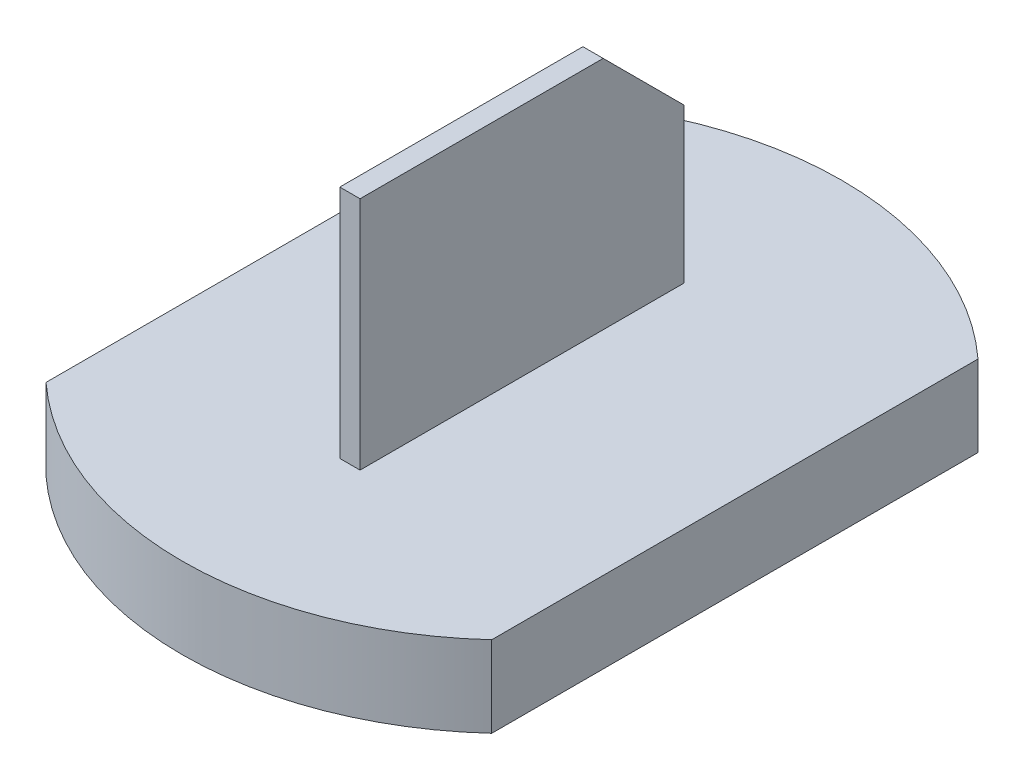
ISO-10303-21;
HEADER;
FILE_DESCRIPTION(('STEP AP214'),'2;1');
FILE_NAME('part.step','',(''),(''),'','','');
FILE_SCHEMA(('AUTOMOTIVE_DESIGN { 1 0 10303 214 1 1 1 1 }'));
ENDSEC;
DATA;
#1=APPLICATION_CONTEXT('core data for automotive mechanical design processes');
#2=APPLICATION_PROTOCOL_DEFINITION('international standard','automotive_design',2000,#1);
#3=PRODUCT_CONTEXT('',#1,'mechanical');
#4=PRODUCT('Part','Part','',(#3));
#5=PRODUCT_RELATED_PRODUCT_CATEGORY('part','',(#4));
#6=PRODUCT_DEFINITION_FORMATION('','',#4);
#7=PRODUCT_DEFINITION_CONTEXT('part definition',#1,'design');
#8=PRODUCT_DEFINITION('design','',#6,#7);
#9=PRODUCT_DEFINITION_SHAPE('','',#8);
#10=(LENGTH_UNIT() NAMED_UNIT(*) SI_UNIT(.MILLI.,.METRE.));
#11=(NAMED_UNIT(*) PLANE_ANGLE_UNIT() SI_UNIT($,.RADIAN.));
#12=(NAMED_UNIT(*) SI_UNIT($,.STERADIAN.) SOLID_ANGLE_UNIT());
#13=UNCERTAINTY_MEASURE_WITH_UNIT(LENGTH_MEASURE(1.E-05),#10,'distance_accuracy_value','');
#14=(GEOMETRIC_REPRESENTATION_CONTEXT(3) GLOBAL_UNCERTAINTY_ASSIGNED_CONTEXT((#13)) GLOBAL_UNIT_ASSIGNED_CONTEXT((#10,
#11,#12)) REPRESENTATION_CONTEXT('',''));
#15=CARTESIAN_POINT('',(0.,0.,0.));
#16=DIRECTION('',(0.,0.,1.));
#17=DIRECTION('',(1.,0.,0.));
#18=AXIS2_PLACEMENT_3D('',#15,#16,#17);
#19=CARTESIAN_POINT('',(34.925,6.35,0.));
#20=DIRECTION('',(1.,0.,0.));
#21=DIRECTION('',(0.,0.,-1.));
#22=AXIS2_PLACEMENT_3D('',#19,#20,#21);
#23=PLANE('',#22);
#24=DIRECTION('',(0.,0.,1.));
#25=VECTOR('',#24,1.);
#26=CARTESIAN_POINT('',(34.925,-6.35,0.));
#27=LINE('',#26,#25);
#28=CARTESIAN_POINT('',(34.925,-6.35,-38.1));
#29=VERTEX_POINT('',#28);
#30=CARTESIAN_POINT('',(34.925,-6.35,38.1));
#31=VERTEX_POINT('',#30);
#32=EDGE_CURVE('E137',#29,#31,#27,.T.);
#33=ORIENTED_EDGE('',*,*,#32,.F.);
#34=DIRECTION('',(0.,-1.,0.));
#35=VECTOR('',#34,1.);
#36=CARTESIAN_POINT('',(34.925,6.35,-38.1));
#37=LINE('',#36,#35);
#38=CARTESIAN_POINT('',(34.925,6.35,-38.1));
#39=VERTEX_POINT('',#38);
#40=EDGE_CURVE('E173',#39,#29,#37,.T.);
#41=ORIENTED_EDGE('',*,*,#40,.F.);
#42=DIRECTION('',(0.,0.,1.));
#43=VECTOR('',#42,1.);
#44=CARTESIAN_POINT('',(34.925,6.35,0.));
#45=LINE('',#44,#43);
#46=CARTESIAN_POINT('',(34.925,6.35,38.1));
#47=VERTEX_POINT('',#46);
#48=EDGE_CURVE('E138',#39,#47,#45,.T.);
#49=ORIENTED_EDGE('',*,*,#48,.T.);
#50=DIRECTION('',(0.,-1.,0.));
#51=VECTOR('',#50,1.);
#52=CARTESIAN_POINT('',(34.925,6.35,38.1));
#53=LINE('',#52,#51);
#54=EDGE_CURVE('E157',#47,#31,#53,.T.);
#55=ORIENTED_EDGE('',*,*,#54,.T.);
#56=EDGE_LOOP('',(#33,#41,#49,#55));
#57=FACE_BOUND('',#56,.T.);
#58=ADVANCED_FACE('F41',(#57),#23,.T.);
#59=CARTESIAN_POINT('',(0.,6.35,0.));
#60=DIRECTION('',(0.,-1.,0.));
#61=DIRECTION('',(0.,0.,-1.));
#62=AXIS2_PLACEMENT_3D('',#59,#60,#61);
#63=CYLINDRICAL_SURFACE('',#62,51.6852553926166);
#64=CARTESIAN_POINT('',(0.,-6.35,0.));
#65=DIRECTION('',(0.,1.,0.));
#66=DIRECTION('',(0.,0.,1.));
#67=AXIS2_PLACEMENT_3D('',#64,#65,#66);
#68=CIRCLE('',#67,51.6852553926166);
#69=CARTESIAN_POINT('',(-34.925,-6.35,-38.1));
#70=VERTEX_POINT('',#69);
#71=EDGE_CURVE('E160',#29,#70,#68,.T.);
#72=ORIENTED_EDGE('',*,*,#71,.T.);
#73=DIRECTION('',(0.,-1.,0.));
#74=VECTOR('',#73,1.);
#75=CARTESIAN_POINT('',(-34.925,6.35,-38.1));
#76=LINE('',#75,#74);
#77=CARTESIAN_POINT('',(-34.925,6.35,-38.1));
#78=VERTEX_POINT('',#77);
#79=EDGE_CURVE('E171',#78,#70,#76,.T.);
#80=ORIENTED_EDGE('',*,*,#79,.F.);
#81=CARTESIAN_POINT('',(0.,6.35,0.));
#82=DIRECTION('',(0.,1.,0.));
#83=DIRECTION('',(0.,0.,1.));
#84=AXIS2_PLACEMENT_3D('',#81,#82,#83);
#85=CIRCLE('',#84,51.6852553926166);
#86=EDGE_CURVE('E141',#39,#78,#85,.T.);
#87=ORIENTED_EDGE('',*,*,#86,.F.);
#88=ORIENTED_EDGE('',*,*,#40,.T.);
#89=EDGE_LOOP('',(#72,#80,#87,#88));
#90=FACE_BOUND('',#89,.T.);
#91=ADVANCED_FACE('F196',(#90),#63,.T.);
#92=CARTESIAN_POINT('',(-34.925,6.35,0.));
#93=DIRECTION('',(-1.,0.,0.));
#94=DIRECTION('',(0.,0.,1.));
#95=AXIS2_PLACEMENT_3D('',#92,#93,#94);
#96=PLANE('',#95);
#97=DIRECTION('',(0.,0.,-1.));
#98=VECTOR('',#97,1.);
#99=CARTESIAN_POINT('',(-34.925,-6.35,0.));
#100=LINE('',#99,#98);
#101=CARTESIAN_POINT('',(-34.925,-6.35,38.1));
#102=VERTEX_POINT('',#101);
#103=EDGE_CURVE('E163',#102,#70,#100,.T.);
#104=ORIENTED_EDGE('',*,*,#103,.F.);
#105=DIRECTION('',(0.,-1.,0.));
#106=VECTOR('',#105,1.);
#107=CARTESIAN_POINT('',(-34.925,6.35,38.1));
#108=LINE('',#107,#106);
#109=CARTESIAN_POINT('',(-34.925,6.35,38.1));
#110=VERTEX_POINT('',#109);
#111=EDGE_CURVE('E169',#110,#102,#108,.T.);
#112=ORIENTED_EDGE('',*,*,#111,.F.);
#113=DIRECTION('',(0.,0.,-1.));
#114=VECTOR('',#113,1.);
#115=CARTESIAN_POINT('',(-34.925,6.35,0.));
#116=LINE('',#115,#114);
#117=EDGE_CURVE('E144',#110,#78,#116,.T.);
#118=ORIENTED_EDGE('',*,*,#117,.T.);
#119=ORIENTED_EDGE('',*,*,#79,.T.);
#120=EDGE_LOOP('',(#104,#112,#118,#119));
#121=FACE_BOUND('',#120,.T.);
#122=ADVANCED_FACE('F201',(#121),#96,.T.);
#123=CARTESIAN_POINT('',(0.,6.35,0.));
#124=DIRECTION('',(0.,-1.,0.));
#125=DIRECTION('',(0.,0.,-1.));
#126=AXIS2_PLACEMENT_3D('',#123,#124,#125);
#127=CYLINDRICAL_SURFACE('',#126,51.6852553926166);
#128=CARTESIAN_POINT('',(0.,-6.35,0.));
#129=DIRECTION('',(0.,1.,0.));
#130=DIRECTION('',(0.,0.,1.));
#131=AXIS2_PLACEMENT_3D('',#128,#129,#130);
#132=CIRCLE('',#131,51.6852553926166);
#133=EDGE_CURVE('E142',#102,#31,#132,.T.);
#134=ORIENTED_EDGE('',*,*,#133,.T.);
#135=ORIENTED_EDGE('',*,*,#54,.F.);
#136=CARTESIAN_POINT('',(0.,6.35,0.));
#137=DIRECTION('',(0.,1.,0.));
#138=DIRECTION('',(0.,0.,1.));
#139=AXIS2_PLACEMENT_3D('',#136,#137,#138);
#140=CIRCLE('',#139,51.6852553926166);
#141=EDGE_CURVE('E147',#110,#47,#140,.T.);
#142=ORIENTED_EDGE('',*,*,#141,.F.);
#143=ORIENTED_EDGE('',*,*,#111,.T.);
#144=EDGE_LOOP('',(#134,#135,#142,#143));
#145=FACE_BOUND('',#144,.T.);
#146=ADVANCED_FACE('F208',(#145),#127,.T.);
#147=CARTESIAN_POINT('',(0.,6.35,0.));
#148=DIRECTION('',(0.,1.,0.));
#149=DIRECTION('',(0.,0.,1.));
#150=AXIS2_PLACEMENT_3D('',#147,#148,#149);
#151=PLANE('',#150);
#152=ORIENTED_EDGE('',*,*,#48,.F.);
#153=ORIENTED_EDGE('',*,*,#86,.T.);
#154=ORIENTED_EDGE('',*,*,#117,.F.);
#155=ORIENTED_EDGE('',*,*,#141,.T.);
#156=EDGE_LOOP('',(#152,#153,#154,#155));
#157=FACE_BOUND('',#156,.T.);
#158=DIRECTION('',(1.,0.,0.));
#159=VECTOR('',#158,1.);
#160=CARTESIAN_POINT('',(0.,6.35,-25.4));
#161=LINE('',#160,#159);
#162=CARTESIAN_POINT('',(-1.5875,6.35,-25.4));
#163=VERTEX_POINT('',#162);
#164=CARTESIAN_POINT('',(1.5875,6.35,-25.4));
#165=VERTEX_POINT('',#164);
#166=EDGE_CURVE('E149',#163,#165,#161,.T.);
#167=ORIENTED_EDGE('',*,*,#166,.T.);
#168=DIRECTION('',(0.,0.,1.));
#169=VECTOR('',#168,1.);
#170=CARTESIAN_POINT('',(1.5875,6.35,0.));
#171=LINE('',#170,#169);
#172=CARTESIAN_POINT('',(1.5875,6.35,25.4));
#173=VERTEX_POINT('',#172);
#174=EDGE_CURVE('E151',#165,#173,#171,.T.);
#175=ORIENTED_EDGE('',*,*,#174,.T.);
#176=DIRECTION('',(1.,0.,0.));
#177=VECTOR('',#176,1.);
#178=CARTESIAN_POINT('',(0.,6.35,25.4));
#179=LINE('',#178,#177);
#180=CARTESIAN_POINT('',(-1.5875,6.34999999999997,25.4));
#181=VERTEX_POINT('',#180);
#182=EDGE_CURVE('E122',#181,#173,#179,.T.);
#183=ORIENTED_EDGE('',*,*,#182,.F.);
#184=DIRECTION('',(0.,0.,1.));
#185=VECTOR('',#184,1.);
#186=CARTESIAN_POINT('',(-1.5875,6.35,0.));
#187=LINE('',#186,#185);
#188=EDGE_CURVE('E154',#163,#181,#187,.T.);
#189=ORIENTED_EDGE('',*,*,#188,.F.);
#190=EDGE_LOOP('',(#167,#175,#183,#189));
#191=FACE_BOUND('',#190,.T.);
#192=ADVANCED_FACE('F187',(#157,#191),#151,.T.);
#193=CARTESIAN_POINT('',(0.,-6.35,0.));
#194=DIRECTION('',(0.,1.,0.));
#195=DIRECTION('',(0.,0.,1.));
#196=AXIS2_PLACEMENT_3D('',#193,#194,#195);
#197=PLANE('',#196);
#198=ORIENTED_EDGE('',*,*,#32,.T.);
#199=ORIENTED_EDGE('',*,*,#133,.F.);
#200=ORIENTED_EDGE('',*,*,#103,.T.);
#201=ORIENTED_EDGE('',*,*,#71,.F.);
#202=EDGE_LOOP('',(#198,#199,#200,#201));
#203=FACE_BOUND('',#202,.T.);
#204=ADVANCED_FACE('F213',(#203),#197,.F.);
#205=CARTESIAN_POINT('',(-1.5875,-57.2491220454734,-25.4));
#206=DIRECTION('',(0.,0.,1.));
#207=DIRECTION('',(1.,0.,0.));
#208=AXIS2_PLACEMENT_3D('',#205,#206,#207);
#209=PLANE('',#208);
#210=DIRECTION('',(0.,1.,0.));
#211=VECTOR('',#210,1.);
#212=CARTESIAN_POINT('',(-1.5875,-57.2491220454734,-25.4));
#213=LINE('',#212,#211);
#214=CARTESIAN_POINT('',(-1.5875,30.48,-25.4));
#215=VERTEX_POINT('',#214);
#216=EDGE_CURVE('E130',#163,#215,#213,.T.);
#217=ORIENTED_EDGE('',*,*,#216,.T.);
#218=DIRECTION('',(1.,0.,0.));
#219=VECTOR('',#218,1.);
#220=CARTESIAN_POINT('',(-1.5875,30.48,-25.4));
#221=LINE('',#220,#219);
#222=CARTESIAN_POINT('',(1.5875,30.48,-25.4));
#223=VERTEX_POINT('',#222);
#224=EDGE_CURVE('E175',#215,#223,#221,.T.);
#225=ORIENTED_EDGE('',*,*,#224,.T.);
#226=DIRECTION('',(0.,1.,0.));
#227=VECTOR('',#226,1.);
#228=CARTESIAN_POINT('',(1.5875,-57.2491220454734,-25.4));
#229=LINE('',#228,#227);
#230=EDGE_CURVE('E123',#165,#223,#229,.T.);
#231=ORIENTED_EDGE('',*,*,#230,.F.);
#232=ORIENTED_EDGE('',*,*,#166,.F.);
#233=EDGE_LOOP('',(#217,#225,#231,#232));
#234=FACE_BOUND('',#233,.T.);
#235=ADVANCED_FACE('F181',(#234),#209,.F.);
#236=CARTESIAN_POINT('',(1.5875,-57.2491220454734,-25.4));
#237=DIRECTION('',(-1.,0.,0.));
#238=DIRECTION('',(0.,0.,1.));
#239=AXIS2_PLACEMENT_3D('',#236,#237,#238);
#240=PLANE('',#239);
#241=ORIENTED_EDGE('',*,*,#230,.T.);
#242=DIRECTION('',(0.,-0.707106781186547,-0.707106781186548));
#243=VECTOR('',#242,1.);
#244=CARTESIAN_POINT('',(1.5875,30.48,-25.4));
#245=LINE('',#244,#243);
#246=CARTESIAN_POINT('',(1.5875,43.18,-12.7));
#247=VERTEX_POINT('',#246);
#248=EDGE_CURVE('E64',#223,#247,#245,.F.);
#249=ORIENTED_EDGE('',*,*,#248,.T.);
#250=DIRECTION('',(0.,0.,1.));
#251=VECTOR('',#250,1.);
#252=CARTESIAN_POINT('',(1.5875,43.18,-25.4));
#253=LINE('',#252,#251);
#254=CARTESIAN_POINT('',(1.5875,43.18,25.4));
#255=VERTEX_POINT('',#254);
#256=EDGE_CURVE('E109',#247,#255,#253,.T.);
#257=ORIENTED_EDGE('',*,*,#256,.T.);
#258=DIRECTION('',(0.,1.,0.));
#259=VECTOR('',#258,1.);
#260=CARTESIAN_POINT('',(1.5875,-57.2491220454734,25.4));
#261=LINE('',#260,#259);
#262=EDGE_CURVE('E113',#173,#255,#261,.T.);
#263=ORIENTED_EDGE('',*,*,#262,.F.);
#264=ORIENTED_EDGE('',*,*,#174,.F.);
#265=EDGE_LOOP('',(#241,#249,#257,#263,#264));
#266=FACE_BOUND('',#265,.T.);
#267=ADVANCED_FACE('F111',(#266),#240,.F.);
#268=CARTESIAN_POINT('',(-1.5875,-57.2491220454734,25.4));
#269=DIRECTION('',(0.,0.,1.));
#270=DIRECTION('',(1.,0.,0.));
#271=AXIS2_PLACEMENT_3D('',#268,#269,#270);
#272=PLANE('',#271);
#273=DIRECTION('',(0.,1.,0.));
#274=VECTOR('',#273,1.);
#275=CARTESIAN_POINT('',(-1.5875,-57.2491220454734,25.4));
#276=LINE('',#275,#274);
#277=CARTESIAN_POINT('',(-1.5875,43.18,25.4));
#278=VERTEX_POINT('',#277);
#279=EDGE_CURVE('E124',#181,#278,#276,.T.);
#280=ORIENTED_EDGE('',*,*,#279,.F.);
#281=ORIENTED_EDGE('',*,*,#182,.T.);
#282=ORIENTED_EDGE('',*,*,#262,.T.);
#283=DIRECTION('',(1.,0.,0.));
#284=VECTOR('',#283,1.);
#285=CARTESIAN_POINT('',(-1.5875,43.18,25.4));
#286=LINE('',#285,#284);
#287=EDGE_CURVE('E115',#278,#255,#286,.T.);
#288=ORIENTED_EDGE('',*,*,#287,.F.);
#289=EDGE_LOOP('',(#280,#281,#282,#288));
#290=FACE_BOUND('',#289,.T.);
#291=ADVANCED_FACE('F121',(#290),#272,.T.);
#292=CARTESIAN_POINT('',(-1.5875,-57.2491220454734,-25.4));
#293=DIRECTION('',(-1.,0.,0.));
#294=DIRECTION('',(0.,0.,1.));
#295=AXIS2_PLACEMENT_3D('',#292,#293,#294);
#296=PLANE('',#295);
#297=DIRECTION('',(0.,0.,1.));
#298=VECTOR('',#297,1.);
#299=CARTESIAN_POINT('',(-1.5875,43.18,-25.4));
#300=LINE('',#299,#298);
#301=CARTESIAN_POINT('',(-1.5875,43.18,-12.7));
#302=VERTEX_POINT('',#301);
#303=EDGE_CURVE('E127',#302,#278,#300,.T.);
#304=ORIENTED_EDGE('',*,*,#303,.F.);
#305=DIRECTION('',(0.,0.707106781186547,0.707106781186548));
#306=VECTOR('',#305,1.);
#307=CARTESIAN_POINT('',(-1.58750000000001,-13.3845610227366,-69.2645610227367));
#308=LINE('',#307,#306);
#309=EDGE_CURVE('E11',#302,#215,#308,.F.);
#310=ORIENTED_EDGE('',*,*,#309,.T.);
#311=ORIENTED_EDGE('',*,*,#216,.F.);
#312=ORIENTED_EDGE('',*,*,#188,.T.);
#313=ORIENTED_EDGE('',*,*,#279,.T.);
#314=EDGE_LOOP('',(#304,#310,#311,#312,#313));
#315=FACE_BOUND('',#314,.T.);
#316=ADVANCED_FACE('F189',(#315),#296,.T.);
#317=CARTESIAN_POINT('',(0.,43.18,0.));
#318=DIRECTION('',(0.,-1.,0.));
#319=DIRECTION('',(0.,0.,-1.));
#320=AXIS2_PLACEMENT_3D('',#317,#318,#319);
#321=PLANE('',#320);
#322=ORIENTED_EDGE('',*,*,#256,.F.);
#323=DIRECTION('',(-1.,0.,0.));
#324=VECTOR('',#323,1.);
#325=CARTESIAN_POINT('',(0.,43.18,-12.7));
#326=LINE('',#325,#324);
#327=EDGE_CURVE('E50',#247,#302,#326,.T.);
#328=ORIENTED_EDGE('',*,*,#327,.T.);
#329=ORIENTED_EDGE('',*,*,#303,.T.);
#330=ORIENTED_EDGE('',*,*,#287,.T.);
#331=EDGE_LOOP('',(#322,#328,#329,#330));
#332=FACE_BOUND('',#331,.T.);
#333=ADVANCED_FACE('F126',(#332),#321,.F.);
#334=CARTESIAN_POINT('',(-1.5875,30.48,-25.4));
#335=DIRECTION('',(0.,-0.707106781186548,0.707106781186547));
#336=DIRECTION('',(1.,0.,0.));
#337=AXIS2_PLACEMENT_3D('',#334,#335,#336);
#338=PLANE('',#337);
#339=ORIENTED_EDGE('',*,*,#309,.F.);
#340=ORIENTED_EDGE('',*,*,#327,.F.);
#341=ORIENTED_EDGE('',*,*,#248,.F.);
#342=ORIENTED_EDGE('',*,*,#224,.F.);
#343=EDGE_LOOP('',(#339,#340,#341,#342));
#344=FACE_BOUND('',#343,.T.);
#345=ADVANCED_FACE('F44',(#344),#338,.F.);
#346=CLOSED_SHELL('',(#58,#91,#122,#146,#192,#204,#235,#267,#291,#316,#333,#345));
#347=MANIFOLD_SOLID_BREP('B2',#346);
#348=ADVANCED_BREP_SHAPE_REPRESENTATION('',(#18,#347),#14);
#349=SHAPE_DEFINITION_REPRESENTATION(#9,#348);
ENDSEC;
END-ISO-10303-21;
